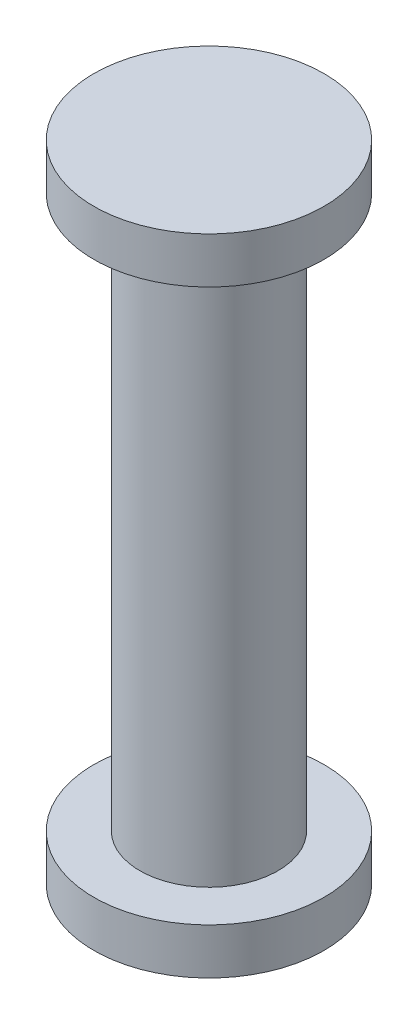
ISO-10303-21;
HEADER;
FILE_DESCRIPTION(('STEP AP214'),'2;1');
FILE_NAME('part.step','',(''),(''),'','','');
FILE_SCHEMA(('AUTOMOTIVE_DESIGN { 1 0 10303 214 1 1 1 1 }'));
ENDSEC;
DATA;
#1=APPLICATION_CONTEXT('core data for automotive mechanical design processes');
#2=APPLICATION_PROTOCOL_DEFINITION('international standard','automotive_design',2000,#1);
#3=PRODUCT_CONTEXT('',#1,'mechanical');
#4=PRODUCT('Part','Part','',(#3));
#5=PRODUCT_RELATED_PRODUCT_CATEGORY('part','',(#4));
#6=PRODUCT_DEFINITION_FORMATION('','',#4);
#7=PRODUCT_DEFINITION_CONTEXT('part definition',#1,'design');
#8=PRODUCT_DEFINITION('design','',#6,#7);
#9=PRODUCT_DEFINITION_SHAPE('','',#8);
#10=(LENGTH_UNIT() NAMED_UNIT(*) SI_UNIT(.MILLI.,.METRE.));
#11=(NAMED_UNIT(*) PLANE_ANGLE_UNIT() SI_UNIT($,.RADIAN.));
#12=(NAMED_UNIT(*) SI_UNIT($,.STERADIAN.) SOLID_ANGLE_UNIT());
#13=UNCERTAINTY_MEASURE_WITH_UNIT(LENGTH_MEASURE(1.E-05),#10,'distance_accuracy_value','');
#14=(GEOMETRIC_REPRESENTATION_CONTEXT(3) GLOBAL_UNCERTAINTY_ASSIGNED_CONTEXT((#13)) GLOBAL_UNIT_ASSIGNED_CONTEXT((#10,
#11,#12)) REPRESENTATION_CONTEXT('',''));
#15=CARTESIAN_POINT('',(0.,0.,0.));
#16=DIRECTION('',(0.,0.,1.));
#17=DIRECTION('',(1.,0.,0.));
#18=AXIS2_PLACEMENT_3D('',#15,#16,#17);
#19=CARTESIAN_POINT('',(-2.5,0.,0.));
#20=DIRECTION('',(0.,1.,0.));
#21=DIRECTION('',(0.,0.,1.));
#22=AXIS2_PLACEMENT_3D('',#19,#20,#21);
#23=PLANE('',#22);
#24=CARTESIAN_POINT('',(0.,0.,0.));
#25=DIRECTION('',(0.,-1.,0.));
#26=DIRECTION('',(0.,0.,-1.));
#27=AXIS2_PLACEMENT_3D('',#24,#25,#26);
#28=CIRCLE('',#27,2.5);
#29=CARTESIAN_POINT('',(0.,0.,-2.5));
#30=VERTEX_POINT('',#29);
#31=EDGE_CURVE('E52',#30,#30,#28,.T.);
#32=ORIENTED_EDGE('',*,*,#31,.T.);
#33=EDGE_LOOP('',(#32));
#34=FACE_BOUND('',#33,.T.);
#35=ADVANCED_FACE('F30',(#34),#23,.F.);
#36=CARTESIAN_POINT('',(0.,14.,0.));
#37=DIRECTION('',(0.,-1.,0.));
#38=DIRECTION('',(0.,0.,-1.));
#39=AXIS2_PLACEMENT_3D('',#36,#37,#38);
#40=PLANE('',#39);
#41=CARTESIAN_POINT('',(0.,14.,0.));
#42=DIRECTION('',(0.,-1.,0.));
#43=DIRECTION('',(0.,0.,-1.));
#44=AXIS2_PLACEMENT_3D('',#41,#42,#43);
#45=CIRCLE('',#44,2.5);
#46=CARTESIAN_POINT('',(0.,14.,-2.5));
#47=VERTEX_POINT('',#46);
#48=EDGE_CURVE('E10',#47,#47,#45,.T.);
#49=ORIENTED_EDGE('',*,*,#48,.F.);
#50=EDGE_LOOP('',(#49));
#51=FACE_BOUND('',#50,.T.);
#52=ADVANCED_FACE('F82',(#51),#40,.F.);
#53=CARTESIAN_POINT('',(0.,0.,0.));
#54=DIRECTION('',(0.,-1.,0.));
#55=DIRECTION('',(0.,0.,-1.));
#56=AXIS2_PLACEMENT_3D('',#53,#54,#55);
#57=CYLINDRICAL_SURFACE('',#56,2.5);
#58=CARTESIAN_POINT('',(0.,13.,0.));
#59=DIRECTION('',(0.,-1.,0.));
#60=DIRECTION('',(0.,0.,-1.));
#61=AXIS2_PLACEMENT_3D('',#58,#59,#60);
#62=CIRCLE('',#61,2.5);
#63=CARTESIAN_POINT('',(0.,13.,-2.5));
#64=VERTEX_POINT('',#63);
#65=EDGE_CURVE('E36',#64,#64,#62,.T.);
#66=ORIENTED_EDGE('',*,*,#65,.F.);
#67=EDGE_LOOP('',(#66));
#68=FACE_BOUND('',#67,.T.);
#69=ORIENTED_EDGE('',*,*,#48,.T.);
#70=EDGE_LOOP('',(#69));
#71=FACE_BOUND('',#70,.T.);
#72=ADVANCED_FACE('F77',(#68,#71),#57,.T.);
#73=CARTESIAN_POINT('',(-2.5,13.,0.));
#74=DIRECTION('',(0.,1.,0.));
#75=DIRECTION('',(0.,0.,1.));
#76=AXIS2_PLACEMENT_3D('',#73,#74,#75);
#77=PLANE('',#76);
#78=CARTESIAN_POINT('',(0.,13.,0.));
#79=DIRECTION('',(0.,-1.,0.));
#80=DIRECTION('',(0.,0.,-1.));
#81=AXIS2_PLACEMENT_3D('',#78,#79,#80);
#82=CIRCLE('',#81,1.5);
#83=CARTESIAN_POINT('',(0.,13.,-1.5));
#84=VERTEX_POINT('',#83);
#85=EDGE_CURVE('E40',#84,#84,#82,.T.);
#86=ORIENTED_EDGE('',*,*,#85,.F.);
#87=EDGE_LOOP('',(#86));
#88=FACE_BOUND('',#87,.T.);
#89=ORIENTED_EDGE('',*,*,#65,.T.);
#90=EDGE_LOOP('',(#89));
#91=FACE_BOUND('',#90,.T.);
#92=ADVANCED_FACE('F72',(#88,#91),#77,.F.);
#93=CARTESIAN_POINT('',(0.,0.,0.));
#94=DIRECTION('',(0.,-1.,0.));
#95=DIRECTION('',(0.,0.,-1.));
#96=AXIS2_PLACEMENT_3D('',#93,#94,#95);
#97=CYLINDRICAL_SURFACE('',#96,1.5);
#98=CARTESIAN_POINT('',(0.,1.,0.));
#99=DIRECTION('',(0.,-1.,0.));
#100=DIRECTION('',(0.,0.,-1.));
#101=AXIS2_PLACEMENT_3D('',#98,#99,#100);
#102=CIRCLE('',#101,1.5);
#103=CARTESIAN_POINT('',(0.,1.,-1.5));
#104=VERTEX_POINT('',#103);
#105=EDGE_CURVE('E44',#104,#104,#102,.T.);
#106=ORIENTED_EDGE('',*,*,#105,.F.);
#107=EDGE_LOOP('',(#106));
#108=FACE_BOUND('',#107,.T.);
#109=ORIENTED_EDGE('',*,*,#85,.T.);
#110=EDGE_LOOP('',(#109));
#111=FACE_BOUND('',#110,.T.);
#112=ADVANCED_FACE('F66',(#108,#111),#97,.T.);
#113=CARTESIAN_POINT('',(-1.5,1.,0.));
#114=DIRECTION('',(0.,-1.,0.));
#115=DIRECTION('',(0.,0.,-1.));
#116=AXIS2_PLACEMENT_3D('',#113,#114,#115);
#117=PLANE('',#116);
#118=CARTESIAN_POINT('',(0.,1.,0.));
#119=DIRECTION('',(0.,-1.,0.));
#120=DIRECTION('',(0.,0.,-1.));
#121=AXIS2_PLACEMENT_3D('',#118,#119,#120);
#122=CIRCLE('',#121,2.5);
#123=CARTESIAN_POINT('',(0.,1.,-2.5));
#124=VERTEX_POINT('',#123);
#125=EDGE_CURVE('E49',#124,#124,#122,.T.);
#126=ORIENTED_EDGE('',*,*,#125,.F.);
#127=EDGE_LOOP('',(#126));
#128=FACE_BOUND('',#127,.T.);
#129=ORIENTED_EDGE('',*,*,#105,.T.);
#130=EDGE_LOOP('',(#129));
#131=FACE_BOUND('',#130,.T.);
#132=ADVANCED_FACE('F60',(#128,#131),#117,.F.);
#133=CARTESIAN_POINT('',(0.,0.,0.));
#134=DIRECTION('',(0.,-1.,0.));
#135=DIRECTION('',(0.,0.,-1.));
#136=AXIS2_PLACEMENT_3D('',#133,#134,#135);
#137=CYLINDRICAL_SURFACE('',#136,2.5);
#138=ORIENTED_EDGE('',*,*,#31,.F.);
#139=EDGE_LOOP('',(#138));
#140=FACE_BOUND('',#139,.T.);
#141=ORIENTED_EDGE('',*,*,#125,.T.);
#142=EDGE_LOOP('',(#141));
#143=FACE_BOUND('',#142,.T.);
#144=ADVANCED_FACE('F57',(#140,#143),#137,.T.);
#145=CLOSED_SHELL('',(#35,#52,#72,#92,#112,#132,#144));
#146=MANIFOLD_SOLID_BREP('B2',#145);
#147=ADVANCED_BREP_SHAPE_REPRESENTATION('',(#18,#146),#14);
#148=SHAPE_DEFINITION_REPRESENTATION(#9,#147);
ENDSEC;
END-ISO-10303-21;
